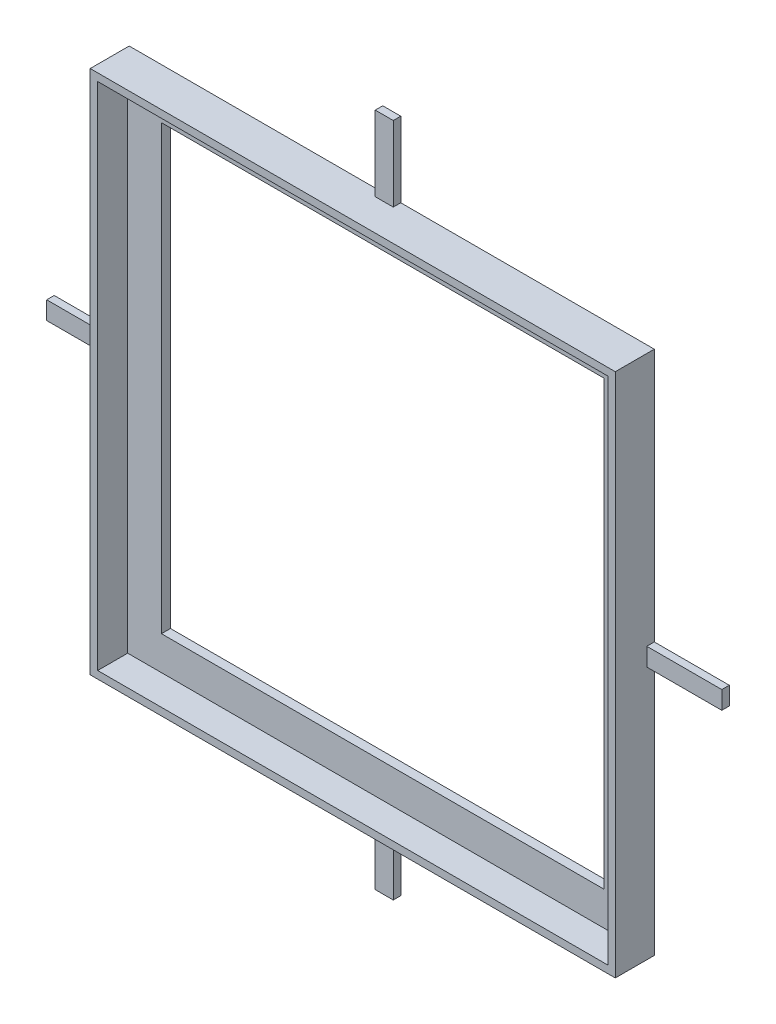
ISO-10303-21;
HEADER;
FILE_DESCRIPTION(('STEP AP214'),'2;1');
FILE_NAME('part.step','',(''),(''),'','','');
FILE_SCHEMA(('AUTOMOTIVE_DESIGN { 1 0 10303 214 1 1 1 1 }'));
ENDSEC;
DATA;
#1=APPLICATION_CONTEXT('core data for automotive mechanical design processes');
#2=APPLICATION_PROTOCOL_DEFINITION('international standard','automotive_design',2000,#1);
#3=PRODUCT_CONTEXT('',#1,'mechanical');
#4=PRODUCT('Part','Part','',(#3));
#5=PRODUCT_RELATED_PRODUCT_CATEGORY('part','',(#4));
#6=PRODUCT_DEFINITION_FORMATION('','',#4);
#7=PRODUCT_DEFINITION_CONTEXT('part definition',#1,'design');
#8=PRODUCT_DEFINITION('design','',#6,#7);
#9=PRODUCT_DEFINITION_SHAPE('','',#8);
#10=(LENGTH_UNIT() NAMED_UNIT(*) SI_UNIT(.MILLI.,.METRE.));
#11=(NAMED_UNIT(*) PLANE_ANGLE_UNIT() SI_UNIT($,.RADIAN.));
#12=(NAMED_UNIT(*) SI_UNIT($,.STERADIAN.) SOLID_ANGLE_UNIT());
#13=UNCERTAINTY_MEASURE_WITH_UNIT(LENGTH_MEASURE(1.E-05),#10,'distance_accuracy_value','');
#14=(GEOMETRIC_REPRESENTATION_CONTEXT(3) GLOBAL_UNCERTAINTY_ASSIGNED_CONTEXT((#13)) GLOBAL_UNIT_ASSIGNED_CONTEXT((#10,
#11,#12)) REPRESENTATION_CONTEXT('',''));
#15=CARTESIAN_POINT('',(0.,0.,0.));
#16=DIRECTION('',(0.,0.,1.));
#17=DIRECTION('',(1.,0.,0.));
#18=AXIS2_PLACEMENT_3D('',#15,#16,#17);
#19=CARTESIAN_POINT('',(-175.,175.,26.));
#20=DIRECTION('',(0.,-1.,0.));
#21=DIRECTION('',(0.,0.,-1.));
#22=AXIS2_PLACEMENT_3D('',#19,#20,#21);
#23=PLANE('',#22);
#24=DIRECTION('',(0.,0.,-1.));
#25=VECTOR('',#24,1.);
#26=CARTESIAN_POINT('',(6.,175.,5.));
#27=LINE('',#26,#25);
#28=CARTESIAN_POINT('',(6.,175.,5.));
#29=VERTEX_POINT('',#28);
#30=CARTESIAN_POINT('',(6.,175.,0.));
#31=VERTEX_POINT('',#30);
#32=EDGE_CURVE('E244',#29,#31,#27,.T.);
#33=ORIENTED_EDGE('',*,*,#32,.F.);
#34=DIRECTION('',(1.,0.,0.));
#35=VECTOR('',#34,1.);
#36=CARTESIAN_POINT('',(6.,175.,5.));
#37=LINE('',#36,#35);
#38=CARTESIAN_POINT('',(-6.,175.,5.));
#39=VERTEX_POINT('',#38);
#40=EDGE_CURVE('E230',#39,#29,#37,.T.);
#41=ORIENTED_EDGE('',*,*,#40,.F.);
#42=DIRECTION('',(0.,0.,-1.));
#43=VECTOR('',#42,1.);
#44=CARTESIAN_POINT('',(-6.,175.,5.));
#45=LINE('',#44,#43);
#46=CARTESIAN_POINT('',(-6.00000000000001,175.,0.));
#47=VERTEX_POINT('',#46);
#48=EDGE_CURVE('E238',#39,#47,#45,.T.);
#49=ORIENTED_EDGE('',*,*,#48,.T.);
#50=DIRECTION('',(-1.,0.,0.));
#51=VECTOR('',#50,1.);
#52=CARTESIAN_POINT('',(-175.,175.,0.));
#53=LINE('',#52,#51);
#54=CARTESIAN_POINT('',(-175.,175.,0.));
#55=VERTEX_POINT('',#54);
#56=EDGE_CURVE('E490',#47,#55,#53,.T.);
#57=ORIENTED_EDGE('',*,*,#56,.T.);
#58=DIRECTION('',(0.,0.,-1.));
#59=VECTOR('',#58,1.);
#60=CARTESIAN_POINT('',(-175.,175.,26.));
#61=LINE('',#60,#59);
#62=CARTESIAN_POINT('',(-175.,175.,26.));
#63=VERTEX_POINT('',#62);
#64=EDGE_CURVE('E48',#63,#55,#61,.T.);
#65=ORIENTED_EDGE('',*,*,#64,.F.);
#66=DIRECTION('',(-1.,0.,0.));
#67=VECTOR('',#66,1.);
#68=CARTESIAN_POINT('',(-175.,175.,26.));
#69=LINE('',#68,#67);
#70=CARTESIAN_POINT('',(175.,175.,26.));
#71=VERTEX_POINT('',#70);
#72=EDGE_CURVE('E475',#71,#63,#69,.T.);
#73=ORIENTED_EDGE('',*,*,#72,.F.);
#74=DIRECTION('',(0.,0.,-1.));
#75=VECTOR('',#74,1.);
#76=CARTESIAN_POINT('',(175.,175.,26.));
#77=LINE('',#76,#75);
#78=CARTESIAN_POINT('',(175.,175.,0.));
#79=VERTEX_POINT('',#78);
#80=EDGE_CURVE('E11',#71,#79,#77,.T.);
#81=ORIENTED_EDGE('',*,*,#80,.T.);
#82=EDGE_CURVE('E491',#79,#31,#53,.T.);
#83=ORIENTED_EDGE('',*,*,#82,.T.);
#84=EDGE_LOOP('',(#33,#41,#49,#57,#65,#73,#81,#83));
#85=FACE_BOUND('',#84,.T.);
#86=ADVANCED_FACE('F39',(#85),#23,.F.);
#87=CARTESIAN_POINT('',(175.,175.,26.));
#88=DIRECTION('',(-1.,0.,0.));
#89=DIRECTION('',(0.,-1.,0.));
#90=AXIS2_PLACEMENT_3D('',#87,#88,#89);
#91=PLANE('',#90);
#92=DIRECTION('',(0.,0.,-1.));
#93=VECTOR('',#92,1.);
#94=CARTESIAN_POINT('',(175.,-6.,5.));
#95=LINE('',#94,#93);
#96=CARTESIAN_POINT('',(175.,-6.,5.));
#97=VERTEX_POINT('',#96);
#98=CARTESIAN_POINT('',(175.,-6.,0.));
#99=VERTEX_POINT('',#98);
#100=EDGE_CURVE('E297',#97,#99,#95,.T.);
#101=ORIENTED_EDGE('',*,*,#100,.F.);
#102=DIRECTION('',(0.,-1.,0.));
#103=VECTOR('',#102,1.);
#104=CARTESIAN_POINT('',(175.,6.,5.));
#105=LINE('',#104,#103);
#106=CARTESIAN_POINT('',(175.,6.,5.));
#107=VERTEX_POINT('',#106);
#108=EDGE_CURVE('E280',#107,#97,#105,.T.);
#109=ORIENTED_EDGE('',*,*,#108,.F.);
#110=DIRECTION('',(0.,0.,-1.));
#111=VECTOR('',#110,1.);
#112=CARTESIAN_POINT('',(175.,6.,5.));
#113=LINE('',#112,#111);
#114=CARTESIAN_POINT('',(175.,6.00000000000001,0.));
#115=VERTEX_POINT('',#114);
#116=EDGE_CURVE('E300',#107,#115,#113,.T.);
#117=ORIENTED_EDGE('',*,*,#116,.T.);
#118=DIRECTION('',(0.,1.,0.));
#119=VECTOR('',#118,1.);
#120=CARTESIAN_POINT('',(175.,175.,0.));
#121=LINE('',#120,#119);
#122=EDGE_CURVE('E461',#115,#79,#121,.T.);
#123=ORIENTED_EDGE('',*,*,#122,.T.);
#124=ORIENTED_EDGE('',*,*,#80,.F.);
#125=DIRECTION('',(0.,1.,0.));
#126=VECTOR('',#125,1.);
#127=CARTESIAN_POINT('',(175.,175.,26.));
#128=LINE('',#127,#126);
#129=CARTESIAN_POINT('',(175.,-175.,26.));
#130=VERTEX_POINT('',#129);
#131=EDGE_CURVE('E471',#130,#71,#128,.T.);
#132=ORIENTED_EDGE('',*,*,#131,.F.);
#133=DIRECTION('',(0.,0.,-1.));
#134=VECTOR('',#133,1.);
#135=CARTESIAN_POINT('',(175.,-175.,26.));
#136=LINE('',#135,#134);
#137=CARTESIAN_POINT('',(175.,-175.,0.));
#138=VERTEX_POINT('',#137);
#139=EDGE_CURVE('E485',#130,#138,#136,.T.);
#140=ORIENTED_EDGE('',*,*,#139,.T.);
#141=EDGE_CURVE('E486',#138,#99,#121,.T.);
#142=ORIENTED_EDGE('',*,*,#141,.T.);
#143=EDGE_LOOP('',(#101,#109,#117,#123,#124,#132,#140,#142));
#144=FACE_BOUND('',#143,.T.);
#145=ADVANCED_FACE('F41',(#144),#91,.F.);
#146=CARTESIAN_POINT('',(-175.,-175.,26.));
#147=DIRECTION('',(0.,1.,0.));
#148=DIRECTION('',(0.,0.,1.));
#149=AXIS2_PLACEMENT_3D('',#146,#147,#148);
#150=PLANE('',#149);
#151=DIRECTION('',(0.,0.,-1.));
#152=VECTOR('',#151,1.);
#153=CARTESIAN_POINT('',(-5.99999999999999,-175.,5.));
#154=LINE('',#153,#152);
#155=CARTESIAN_POINT('',(-5.99999999999999,-175.,5.));
#156=VERTEX_POINT('',#155);
#157=CARTESIAN_POINT('',(-5.99999999999999,-175.,0.));
#158=VERTEX_POINT('',#157);
#159=EDGE_CURVE('E333',#156,#158,#154,.T.);
#160=ORIENTED_EDGE('',*,*,#159,.F.);
#161=DIRECTION('',(-1.,0.,0.));
#162=VECTOR('',#161,1.);
#163=CARTESIAN_POINT('',(6.00000000000001,-175.,5.));
#164=LINE('',#163,#162);
#165=CARTESIAN_POINT('',(6.00000000000001,-175.,5.));
#166=VERTEX_POINT('',#165);
#167=EDGE_CURVE('E315',#166,#156,#164,.T.);
#168=ORIENTED_EDGE('',*,*,#167,.F.);
#169=DIRECTION('',(0.,0.,-1.));
#170=VECTOR('',#169,1.);
#171=CARTESIAN_POINT('',(6.00000000000001,-175.,5.));
#172=LINE('',#171,#170);
#173=CARTESIAN_POINT('',(6.00000000000001,-175.,0.));
#174=VERTEX_POINT('',#173);
#175=EDGE_CURVE('E336',#166,#174,#172,.T.);
#176=ORIENTED_EDGE('',*,*,#175,.T.);
#177=DIRECTION('',(1.,0.,0.));
#178=VECTOR('',#177,1.);
#179=CARTESIAN_POINT('',(-175.,-175.,0.));
#180=LINE('',#179,#178);
#181=EDGE_CURVE('E499',#174,#138,#180,.T.);
#182=ORIENTED_EDGE('',*,*,#181,.T.);
#183=ORIENTED_EDGE('',*,*,#139,.F.);
#184=DIRECTION('',(1.,0.,0.));
#185=VECTOR('',#184,1.);
#186=CARTESIAN_POINT('',(-175.,-175.,26.));
#187=LINE('',#186,#185);
#188=CARTESIAN_POINT('',(-175.,-175.,26.));
#189=VERTEX_POINT('',#188);
#190=EDGE_CURVE('E482',#189,#130,#187,.T.);
#191=ORIENTED_EDGE('',*,*,#190,.F.);
#192=DIRECTION('',(0.,0.,-1.));
#193=VECTOR('',#192,1.);
#194=CARTESIAN_POINT('',(-175.,-175.,26.));
#195=LINE('',#194,#193);
#196=CARTESIAN_POINT('',(-175.,-175.,0.));
#197=VERTEX_POINT('',#196);
#198=EDGE_CURVE('E506',#189,#197,#195,.T.);
#199=ORIENTED_EDGE('',*,*,#198,.T.);
#200=EDGE_CURVE('E476',#197,#158,#180,.T.);
#201=ORIENTED_EDGE('',*,*,#200,.T.);
#202=EDGE_LOOP('',(#160,#168,#176,#182,#183,#191,#199,#201));
#203=FACE_BOUND('',#202,.T.);
#204=ADVANCED_FACE('F584',(#203),#150,.F.);
#205=CARTESIAN_POINT('',(-175.,175.,26.));
#206=DIRECTION('',(1.,0.,0.));
#207=DIRECTION('',(0.,1.,0.));
#208=AXIS2_PLACEMENT_3D('',#205,#206,#207);
#209=PLANE('',#208);
#210=DIRECTION('',(0.,0.,-1.));
#211=VECTOR('',#210,1.);
#212=CARTESIAN_POINT('',(-175.,6.,5.));
#213=LINE('',#212,#211);
#214=CARTESIAN_POINT('',(-175.,6.,5.));
#215=VERTEX_POINT('',#214);
#216=CARTESIAN_POINT('',(-175.,6.,0.));
#217=VERTEX_POINT('',#216);
#218=EDGE_CURVE('E371',#215,#217,#213,.T.);
#219=ORIENTED_EDGE('',*,*,#218,.F.);
#220=DIRECTION('',(0.,1.,0.));
#221=VECTOR('',#220,1.);
#222=CARTESIAN_POINT('',(-175.,6.,5.));
#223=LINE('',#222,#221);
#224=CARTESIAN_POINT('',(-175.,-6.,5.));
#225=VERTEX_POINT('',#224);
#226=EDGE_CURVE('E353',#225,#215,#223,.T.);
#227=ORIENTED_EDGE('',*,*,#226,.F.);
#228=DIRECTION('',(0.,0.,-1.));
#229=VECTOR('',#228,1.);
#230=CARTESIAN_POINT('',(-175.,-6.,5.));
#231=LINE('',#230,#229);
#232=CARTESIAN_POINT('',(-175.,-6.00000000000001,0.));
#233=VERTEX_POINT('',#232);
#234=EDGE_CURVE('E374',#225,#233,#231,.T.);
#235=ORIENTED_EDGE('',*,*,#234,.T.);
#236=DIRECTION('',(0.,-1.,0.));
#237=VECTOR('',#236,1.);
#238=CARTESIAN_POINT('',(-175.,175.,0.));
#239=LINE('',#238,#237);
#240=EDGE_CURVE('E494',#233,#197,#239,.T.);
#241=ORIENTED_EDGE('',*,*,#240,.T.);
#242=ORIENTED_EDGE('',*,*,#198,.F.);
#243=DIRECTION('',(0.,-1.,0.));
#244=VECTOR('',#243,1.);
#245=CARTESIAN_POINT('',(-175.,175.,26.));
#246=LINE('',#245,#244);
#247=EDGE_CURVE('E479',#63,#189,#246,.T.);
#248=ORIENTED_EDGE('',*,*,#247,.F.);
#249=ORIENTED_EDGE('',*,*,#64,.T.);
#250=EDGE_CURVE('E495',#55,#217,#239,.T.);
#251=ORIENTED_EDGE('',*,*,#250,.T.);
#252=EDGE_LOOP('',(#219,#227,#235,#241,#242,#248,#249,#251));
#253=FACE_BOUND('',#252,.T.);
#254=ADVANCED_FACE('F516',(#253),#209,.F.);
#255=CARTESIAN_POINT('',(0.,0.,26.));
#256=DIRECTION('',(0.,0.,1.));
#257=DIRECTION('',(1.,0.,0.));
#258=AXIS2_PLACEMENT_3D('',#255,#256,#257);
#259=PLANE('',#258);
#260=DIRECTION('',(0.,1.,0.));
#261=VECTOR('',#260,1.);
#262=CARTESIAN_POINT('',(170.,170.,26.));
#263=LINE('',#262,#261);
#264=CARTESIAN_POINT('',(170.,-170.,26.));
#265=VERTEX_POINT('',#264);
#266=CARTESIAN_POINT('',(170.,170.,26.));
#267=VERTEX_POINT('',#266);
#268=EDGE_CURVE('E426',#265,#267,#263,.T.);
#269=ORIENTED_EDGE('',*,*,#268,.F.);
#270=DIRECTION('',(1.,0.,0.));
#271=VECTOR('',#270,1.);
#272=CARTESIAN_POINT('',(-170.,-170.,26.));
#273=LINE('',#272,#271);
#274=CARTESIAN_POINT('',(-170.,-170.,26.));
#275=VERTEX_POINT('',#274);
#276=EDGE_CURVE('E432',#275,#265,#273,.T.);
#277=ORIENTED_EDGE('',*,*,#276,.F.);
#278=DIRECTION('',(0.,-1.,0.));
#279=VECTOR('',#278,1.);
#280=CARTESIAN_POINT('',(-170.,170.,26.));
#281=LINE('',#280,#279);
#282=CARTESIAN_POINT('',(-170.,170.,26.));
#283=VERTEX_POINT('',#282);
#284=EDGE_CURVE('E451',#283,#275,#281,.T.);
#285=ORIENTED_EDGE('',*,*,#284,.F.);
#286=DIRECTION('',(-1.,0.,0.));
#287=VECTOR('',#286,1.);
#288=CARTESIAN_POINT('',(-170.,170.,26.));
#289=LINE('',#288,#287);
#290=EDGE_CURVE('E447',#267,#283,#289,.T.);
#291=ORIENTED_EDGE('',*,*,#290,.F.);
#292=EDGE_LOOP('',(#269,#277,#285,#291));
#293=FACE_BOUND('',#292,.T.);
#294=ORIENTED_EDGE('',*,*,#131,.T.);
#295=ORIENTED_EDGE('',*,*,#72,.T.);
#296=ORIENTED_EDGE('',*,*,#247,.T.);
#297=ORIENTED_EDGE('',*,*,#190,.T.);
#298=EDGE_LOOP('',(#294,#295,#296,#297));
#299=FACE_BOUND('',#298,.T.);
#300=ADVANCED_FACE('F553',(#293,#299),#259,.T.);
#301=CARTESIAN_POINT('',(0.,0.,0.));
#302=DIRECTION('',(0.,0.,1.));
#303=DIRECTION('',(1.,0.,0.));
#304=AXIS2_PLACEMENT_3D('',#301,#302,#303);
#305=PLANE('',#304);
#306=DIRECTION('',(1.,0.,0.));
#307=VECTOR('',#306,1.);
#308=CARTESIAN_POINT('',(-147.5,-147.5,0.));
#309=LINE('',#308,#307);
#310=CARTESIAN_POINT('',(-147.5,-147.5,0.));
#311=VERTEX_POINT('',#310);
#312=CARTESIAN_POINT('',(147.5,-147.5,0.));
#313=VERTEX_POINT('',#312);
#314=EDGE_CURVE('E394',#311,#313,#309,.T.);
#315=ORIENTED_EDGE('',*,*,#314,.T.);
#316=DIRECTION('',(0.,1.,0.));
#317=VECTOR('',#316,1.);
#318=CARTESIAN_POINT('',(147.5,147.5,0.));
#319=LINE('',#318,#317);
#320=CARTESIAN_POINT('',(147.5,147.5,0.));
#321=VERTEX_POINT('',#320);
#322=EDGE_CURVE('E382',#313,#321,#319,.T.);
#323=ORIENTED_EDGE('',*,*,#322,.T.);
#324=DIRECTION('',(-1.,0.,0.));
#325=VECTOR('',#324,1.);
#326=CARTESIAN_POINT('',(-147.5,147.5,0.));
#327=LINE('',#326,#325);
#328=CARTESIAN_POINT('',(-147.5,147.5,0.));
#329=VERTEX_POINT('',#328);
#330=EDGE_CURVE('E386',#321,#329,#327,.T.);
#331=ORIENTED_EDGE('',*,*,#330,.T.);
#332=DIRECTION('',(0.,-1.,0.));
#333=VECTOR('',#332,1.);
#334=CARTESIAN_POINT('',(-147.5,147.5,0.));
#335=LINE('',#334,#333);
#336=EDGE_CURVE('E390',#329,#311,#335,.T.);
#337=ORIENTED_EDGE('',*,*,#336,.T.);
#338=EDGE_LOOP('',(#315,#323,#331,#337));
#339=FACE_BOUND('',#338,.T.);
#340=ORIENTED_EDGE('',*,*,#141,.F.);
#341=ORIENTED_EDGE('',*,*,#181,.F.);
#342=DIRECTION('',(0.,1.,0.));
#343=VECTOR('',#342,1.);
#344=CARTESIAN_POINT('',(6.,-225.,0.));
#345=LINE('',#344,#343);
#346=CARTESIAN_POINT('',(6.,-225.,0.));
#347=VERTEX_POINT('',#346);
#348=EDGE_CURVE('E325',#347,#174,#345,.T.);
#349=ORIENTED_EDGE('',*,*,#348,.F.);
#350=DIRECTION('',(1.,0.,0.));
#351=VECTOR('',#350,1.);
#352=CARTESIAN_POINT('',(-6.,-225.,0.));
#353=LINE('',#352,#351);
#354=CARTESIAN_POINT('',(-6.,-225.,0.));
#355=VERTEX_POINT('',#354);
#356=EDGE_CURVE('E306',#355,#347,#353,.T.);
#357=ORIENTED_EDGE('',*,*,#356,.F.);
#358=DIRECTION('',(0.,-1.,0.));
#359=VECTOR('',#358,1.);
#360=CARTESIAN_POINT('',(-6.,-225.,0.));
#361=LINE('',#360,#359);
#362=EDGE_CURVE('E312',#158,#355,#361,.T.);
#363=ORIENTED_EDGE('',*,*,#362,.F.);
#364=ORIENTED_EDGE('',*,*,#200,.F.);
#365=ORIENTED_EDGE('',*,*,#240,.F.);
#366=DIRECTION('',(1.,0.,0.));
#367=VECTOR('',#366,1.);
#368=CARTESIAN_POINT('',(-225.,-6.,0.));
#369=LINE('',#368,#367);
#370=CARTESIAN_POINT('',(-225.,-6.,0.));
#371=VERTEX_POINT('',#370);
#372=EDGE_CURVE('E363',#371,#233,#369,.T.);
#373=ORIENTED_EDGE('',*,*,#372,.F.);
#374=DIRECTION('',(0.,-1.,0.));
#375=VECTOR('',#374,1.);
#376=CARTESIAN_POINT('',(-225.,6.,0.));
#377=LINE('',#376,#375);
#378=CARTESIAN_POINT('',(-225.,6.,0.));
#379=VERTEX_POINT('',#378);
#380=EDGE_CURVE('E344',#379,#371,#377,.T.);
#381=ORIENTED_EDGE('',*,*,#380,.F.);
#382=DIRECTION('',(-1.,0.,0.));
#383=VECTOR('',#382,1.);
#384=CARTESIAN_POINT('',(-225.,6.,0.));
#385=LINE('',#384,#383);
#386=EDGE_CURVE('E350',#217,#379,#385,.T.);
#387=ORIENTED_EDGE('',*,*,#386,.F.);
#388=ORIENTED_EDGE('',*,*,#250,.F.);
#389=ORIENTED_EDGE('',*,*,#56,.F.);
#390=DIRECTION('',(0.,-1.,0.));
#391=VECTOR('',#390,1.);
#392=CARTESIAN_POINT('',(-6.,225.,0.));
#393=LINE('',#392,#391);
#394=CARTESIAN_POINT('',(-6.,225.,0.));
#395=VERTEX_POINT('',#394);
#396=EDGE_CURVE('E55',#395,#47,#393,.T.);
#397=ORIENTED_EDGE('',*,*,#396,.F.);
#398=DIRECTION('',(-1.,0.,0.));
#399=VECTOR('',#398,1.);
#400=CARTESIAN_POINT('',(-6.,225.,0.));
#401=LINE('',#400,#399);
#402=CARTESIAN_POINT('',(6.,225.,0.));
#403=VERTEX_POINT('',#402);
#404=EDGE_CURVE('E236',#403,#395,#401,.T.);
#405=ORIENTED_EDGE('',*,*,#404,.F.);
#406=DIRECTION('',(0.,1.,0.));
#407=VECTOR('',#406,1.);
#408=CARTESIAN_POINT('',(6.,225.,0.));
#409=LINE('',#408,#407);
#410=EDGE_CURVE('E259',#31,#403,#409,.T.);
#411=ORIENTED_EDGE('',*,*,#410,.F.);
#412=ORIENTED_EDGE('',*,*,#82,.F.);
#413=ORIENTED_EDGE('',*,*,#122,.F.);
#414=DIRECTION('',(-1.,0.,0.));
#415=VECTOR('',#414,1.);
#416=CARTESIAN_POINT('',(225.,6.,0.));
#417=LINE('',#416,#415);
#418=CARTESIAN_POINT('',(225.,6.,0.));
#419=VERTEX_POINT('',#418);
#420=EDGE_CURVE('E63',#419,#115,#417,.T.);
#421=ORIENTED_EDGE('',*,*,#420,.F.);
#422=DIRECTION('',(0.,1.,0.));
#423=VECTOR('',#422,1.);
#424=CARTESIAN_POINT('',(225.,6.,0.));
#425=LINE('',#424,#423);
#426=CARTESIAN_POINT('',(225.,-6.,0.));
#427=VERTEX_POINT('',#426);
#428=EDGE_CURVE('E243',#427,#419,#425,.T.);
#429=ORIENTED_EDGE('',*,*,#428,.F.);
#430=DIRECTION('',(1.,0.,0.));
#431=VECTOR('',#430,1.);
#432=CARTESIAN_POINT('',(225.,-6.,0.));
#433=LINE('',#432,#431);
#434=EDGE_CURVE('E277',#99,#427,#433,.T.);
#435=ORIENTED_EDGE('',*,*,#434,.F.);
#436=EDGE_LOOP('',(#340,#341,#349,#357,#363,#364,#365,#373,#381,#387,#388,#389,#397,#405,#411,
#412,#413,#421,#429,#435));
#437=FACE_BOUND('',#436,.T.);
#438=ADVANCED_FACE('F521',(#339,#437),#305,.F.);
#439=CARTESIAN_POINT('',(170.,170.,6.));
#440=DIRECTION('',(1.,0.,0.));
#441=DIRECTION('',(0.,1.,0.));
#442=AXIS2_PLACEMENT_3D('',#439,#440,#441);
#443=PLANE('',#442);
#444=ORIENTED_EDGE('',*,*,#268,.T.);
#445=DIRECTION('',(0.,0.,1.));
#446=VECTOR('',#445,1.);
#447=CARTESIAN_POINT('',(170.,170.,6.));
#448=LINE('',#447,#446);
#449=CARTESIAN_POINT('',(170.,170.,6.));
#450=VERTEX_POINT('',#449);
#451=EDGE_CURVE('E444',#450,#267,#448,.T.);
#452=ORIENTED_EDGE('',*,*,#451,.F.);
#453=DIRECTION('',(0.,1.,0.));
#454=VECTOR('',#453,1.);
#455=CARTESIAN_POINT('',(170.,170.,6.));
#456=LINE('',#455,#454);
#457=CARTESIAN_POINT('',(170.,-170.,6.));
#458=VERTEX_POINT('',#457);
#459=EDGE_CURVE('E427',#458,#450,#456,.T.);
#460=ORIENTED_EDGE('',*,*,#459,.F.);
#461=DIRECTION('',(0.,0.,1.));
#462=VECTOR('',#461,1.);
#463=CARTESIAN_POINT('',(170.,-170.,6.));
#464=LINE('',#463,#462);
#465=EDGE_CURVE('E458',#458,#265,#464,.T.);
#466=ORIENTED_EDGE('',*,*,#465,.T.);
#467=EDGE_LOOP('',(#444,#452,#460,#466));
#468=FACE_BOUND('',#467,.T.);
#469=ADVANCED_FACE('F592',(#468),#443,.F.);
#470=CARTESIAN_POINT('',(-170.,-170.,6.));
#471=DIRECTION('',(0.,-1.,0.));
#472=DIRECTION('',(0.,0.,-1.));
#473=AXIS2_PLACEMENT_3D('',#470,#471,#472);
#474=PLANE('',#473);
#475=ORIENTED_EDGE('',*,*,#276,.T.);
#476=ORIENTED_EDGE('',*,*,#465,.F.);
#477=DIRECTION('',(1.,0.,0.));
#478=VECTOR('',#477,1.);
#479=CARTESIAN_POINT('',(-170.,-170.,6.));
#480=LINE('',#479,#478);
#481=CARTESIAN_POINT('',(-170.,-170.,6.));
#482=VERTEX_POINT('',#481);
#483=EDGE_CURVE('E440',#482,#458,#480,.T.);
#484=ORIENTED_EDGE('',*,*,#483,.F.);
#485=DIRECTION('',(0.,0.,1.));
#486=VECTOR('',#485,1.);
#487=CARTESIAN_POINT('',(-170.,-170.,6.));
#488=LINE('',#487,#486);
#489=EDGE_CURVE('E462',#482,#275,#488,.T.);
#490=ORIENTED_EDGE('',*,*,#489,.T.);
#491=EDGE_LOOP('',(#475,#476,#484,#490));
#492=FACE_BOUND('',#491,.T.);
#493=ADVANCED_FACE('F599',(#492),#474,.F.);
#494=CARTESIAN_POINT('',(-170.,170.,6.));
#495=DIRECTION('',(-1.,0.,0.));
#496=DIRECTION('',(0.,-1.,0.));
#497=AXIS2_PLACEMENT_3D('',#494,#495,#496);
#498=PLANE('',#497);
#499=ORIENTED_EDGE('',*,*,#284,.T.);
#500=ORIENTED_EDGE('',*,*,#489,.F.);
#501=DIRECTION('',(0.,-1.,0.));
#502=VECTOR('',#501,1.);
#503=CARTESIAN_POINT('',(-170.,170.,6.));
#504=LINE('',#503,#502);
#505=CARTESIAN_POINT('',(-170.,170.,6.));
#506=VERTEX_POINT('',#505);
#507=EDGE_CURVE('E436',#506,#482,#504,.T.);
#508=ORIENTED_EDGE('',*,*,#507,.F.);
#509=DIRECTION('',(0.,0.,1.));
#510=VECTOR('',#509,1.);
#511=CARTESIAN_POINT('',(-170.,170.,6.));
#512=LINE('',#511,#510);
#513=EDGE_CURVE('E465',#506,#283,#512,.T.);
#514=ORIENTED_EDGE('',*,*,#513,.T.);
#515=EDGE_LOOP('',(#499,#500,#508,#514));
#516=FACE_BOUND('',#515,.T.);
#517=ADVANCED_FACE('F605',(#516),#498,.F.);
#518=CARTESIAN_POINT('',(-170.,170.,6.));
#519=DIRECTION('',(0.,1.,0.));
#520=DIRECTION('',(0.,0.,1.));
#521=AXIS2_PLACEMENT_3D('',#518,#519,#520);
#522=PLANE('',#521);
#523=ORIENTED_EDGE('',*,*,#290,.T.);
#524=ORIENTED_EDGE('',*,*,#513,.F.);
#525=DIRECTION('',(-1.,0.,0.));
#526=VECTOR('',#525,1.);
#527=CARTESIAN_POINT('',(-170.,170.,6.));
#528=LINE('',#527,#526);
#529=EDGE_CURVE('E431',#450,#506,#528,.T.);
#530=ORIENTED_EDGE('',*,*,#529,.F.);
#531=ORIENTED_EDGE('',*,*,#451,.T.);
#532=EDGE_LOOP('',(#523,#524,#530,#531));
#533=FACE_BOUND('',#532,.T.);
#534=ADVANCED_FACE('F601',(#533),#522,.F.);
#535=CARTESIAN_POINT('',(0.,0.,6.));
#536=DIRECTION('',(0.,0.,1.));
#537=DIRECTION('',(1.,0.,0.));
#538=AXIS2_PLACEMENT_3D('',#535,#536,#537);
#539=PLANE('',#538);
#540=DIRECTION('',(1.,0.,0.));
#541=VECTOR('',#540,1.);
#542=CARTESIAN_POINT('',(-147.5,-147.5,6.));
#543=LINE('',#542,#541);
#544=CARTESIAN_POINT('',(-147.5,-147.5,6.));
#545=VERTEX_POINT('',#544);
#546=CARTESIAN_POINT('',(147.5,-147.5,6.));
#547=VERTEX_POINT('',#546);
#548=EDGE_CURVE('E423',#545,#547,#543,.T.);
#549=ORIENTED_EDGE('',*,*,#548,.F.);
#550=DIRECTION('',(0.,-1.,0.));
#551=VECTOR('',#550,1.);
#552=CARTESIAN_POINT('',(-147.5,147.5,6.));
#553=LINE('',#552,#551);
#554=CARTESIAN_POINT('',(-147.5,147.5,6.));
#555=VERTEX_POINT('',#554);
#556=EDGE_CURVE('E420',#555,#545,#553,.T.);
#557=ORIENTED_EDGE('',*,*,#556,.F.);
#558=DIRECTION('',(-1.,0.,0.));
#559=VECTOR('',#558,1.);
#560=CARTESIAN_POINT('',(-147.5,147.5,6.));
#561=LINE('',#560,#559);
#562=CARTESIAN_POINT('',(147.5,147.5,6.));
#563=VERTEX_POINT('',#562);
#564=EDGE_CURVE('E417',#563,#555,#561,.T.);
#565=ORIENTED_EDGE('',*,*,#564,.F.);
#566=DIRECTION('',(0.,1.,0.));
#567=VECTOR('',#566,1.);
#568=CARTESIAN_POINT('',(147.5,147.5,6.));
#569=LINE('',#568,#567);
#570=EDGE_CURVE('E403',#547,#563,#569,.T.);
#571=ORIENTED_EDGE('',*,*,#570,.F.);
#572=EDGE_LOOP('',(#549,#557,#565,#571));
#573=FACE_BOUND('',#572,.T.);
#574=ORIENTED_EDGE('',*,*,#459,.T.);
#575=ORIENTED_EDGE('',*,*,#529,.T.);
#576=ORIENTED_EDGE('',*,*,#507,.T.);
#577=ORIENTED_EDGE('',*,*,#483,.T.);
#578=EDGE_LOOP('',(#574,#575,#576,#577));
#579=FACE_BOUND('',#578,.T.);
#580=ADVANCED_FACE('F604',(#573,#579),#539,.T.);
#581=CARTESIAN_POINT('',(147.5,147.5,0.));
#582=DIRECTION('',(1.,0.,0.));
#583=DIRECTION('',(0.,0.,-1.));
#584=AXIS2_PLACEMENT_3D('',#581,#582,#583);
#585=PLANE('',#584);
#586=ORIENTED_EDGE('',*,*,#570,.T.);
#587=DIRECTION('',(0.,0.,1.));
#588=VECTOR('',#587,1.);
#589=CARTESIAN_POINT('',(147.5,147.5,0.));
#590=LINE('',#589,#588);
#591=EDGE_CURVE('E398',#321,#563,#590,.T.);
#592=ORIENTED_EDGE('',*,*,#591,.F.);
#593=ORIENTED_EDGE('',*,*,#322,.F.);
#594=DIRECTION('',(0.,0.,1.));
#595=VECTOR('',#594,1.);
#596=CARTESIAN_POINT('',(147.5,-147.5,0.));
#597=LINE('',#596,#595);
#598=EDGE_CURVE('E399',#313,#547,#597,.T.);
#599=ORIENTED_EDGE('',*,*,#598,.T.);
#600=EDGE_LOOP('',(#586,#592,#593,#599));
#601=FACE_BOUND('',#600,.T.);
#602=ADVANCED_FACE('F615',(#601),#585,.F.);
#603=CARTESIAN_POINT('',(-147.5,-147.5,0.));
#604=DIRECTION('',(0.,-1.,0.));
#605=DIRECTION('',(0.,0.,-1.));
#606=AXIS2_PLACEMENT_3D('',#603,#604,#605);
#607=PLANE('',#606);
#608=ORIENTED_EDGE('',*,*,#548,.T.);
#609=ORIENTED_EDGE('',*,*,#598,.F.);
#610=ORIENTED_EDGE('',*,*,#314,.F.);
#611=DIRECTION('',(0.,0.,1.));
#612=VECTOR('',#611,1.);
#613=CARTESIAN_POINT('',(-147.5,-147.5,0.));
#614=LINE('',#613,#612);
#615=EDGE_CURVE('E404',#311,#545,#614,.T.);
#616=ORIENTED_EDGE('',*,*,#615,.T.);
#617=EDGE_LOOP('',(#608,#609,#610,#616));
#618=FACE_BOUND('',#617,.T.);
#619=ADVANCED_FACE('F619',(#618),#607,.F.);
#620=CARTESIAN_POINT('',(-147.5,147.5,0.));
#621=DIRECTION('',(-1.,0.,0.));
#622=DIRECTION('',(0.,0.,1.));
#623=AXIS2_PLACEMENT_3D('',#620,#621,#622);
#624=PLANE('',#623);
#625=ORIENTED_EDGE('',*,*,#556,.T.);
#626=ORIENTED_EDGE('',*,*,#615,.F.);
#627=ORIENTED_EDGE('',*,*,#336,.F.);
#628=DIRECTION('',(0.,0.,1.));
#629=VECTOR('',#628,1.);
#630=CARTESIAN_POINT('',(-147.5,147.5,0.));
#631=LINE('',#630,#629);
#632=EDGE_CURVE('E408',#329,#555,#631,.T.);
#633=ORIENTED_EDGE('',*,*,#632,.T.);
#634=EDGE_LOOP('',(#625,#626,#627,#633));
#635=FACE_BOUND('',#634,.T.);
#636=ADVANCED_FACE('F624',(#635),#624,.F.);
#637=CARTESIAN_POINT('',(-147.5,147.5,0.));
#638=DIRECTION('',(0.,1.,0.));
#639=DIRECTION('',(0.,0.,1.));
#640=AXIS2_PLACEMENT_3D('',#637,#638,#639);
#641=PLANE('',#640);
#642=ORIENTED_EDGE('',*,*,#564,.T.);
#643=ORIENTED_EDGE('',*,*,#632,.F.);
#644=ORIENTED_EDGE('',*,*,#330,.F.);
#645=ORIENTED_EDGE('',*,*,#591,.T.);
#646=EDGE_LOOP('',(#642,#643,#644,#645));
#647=FACE_BOUND('',#646,.T.);
#648=ADVANCED_FACE('F621',(#647),#641,.F.);
#649=CARTESIAN_POINT('',(-225.,6.,5.));
#650=DIRECTION('',(1.,0.,0.));
#651=DIRECTION('',(0.,0.,-1.));
#652=AXIS2_PLACEMENT_3D('',#649,#650,#651);
#653=PLANE('',#652);
#654=ORIENTED_EDGE('',*,*,#380,.T.);
#655=DIRECTION('',(0.,0.,-1.));
#656=VECTOR('',#655,1.);
#657=CARTESIAN_POINT('',(-225.,-6.,5.));
#658=LINE('',#657,#656);
#659=CARTESIAN_POINT('',(-225.,-6.,5.));
#660=VERTEX_POINT('',#659);
#661=EDGE_CURVE('E378',#660,#371,#658,.T.);
#662=ORIENTED_EDGE('',*,*,#661,.F.);
#663=DIRECTION('',(0.,-1.,0.));
#664=VECTOR('',#663,1.);
#665=CARTESIAN_POINT('',(-225.,6.,5.));
#666=LINE('',#665,#664);
#667=CARTESIAN_POINT('',(-225.,6.,5.));
#668=VERTEX_POINT('',#667);
#669=EDGE_CURVE('E345',#668,#660,#666,.T.);
#670=ORIENTED_EDGE('',*,*,#669,.F.);
#671=DIRECTION('',(0.,0.,-1.));
#672=VECTOR('',#671,1.);
#673=CARTESIAN_POINT('',(-225.,6.,5.));
#674=LINE('',#673,#672);
#675=EDGE_CURVE('E359',#668,#379,#674,.T.);
#676=ORIENTED_EDGE('',*,*,#675,.T.);
#677=EDGE_LOOP('',(#654,#662,#670,#676));
#678=FACE_BOUND('',#677,.T.);
#679=ADVANCED_FACE('F529',(#678),#653,.F.);
#680=CARTESIAN_POINT('',(-225.,-6.,5.));
#681=DIRECTION('',(0.,1.,0.));
#682=DIRECTION('',(0.,0.,1.));
#683=AXIS2_PLACEMENT_3D('',#680,#681,#682);
#684=PLANE('',#683);
#685=ORIENTED_EDGE('',*,*,#372,.T.);
#686=ORIENTED_EDGE('',*,*,#234,.F.);
#687=DIRECTION('',(1.,0.,0.));
#688=VECTOR('',#687,1.);
#689=CARTESIAN_POINT('',(-225.,-6.,5.));
#690=LINE('',#689,#688);
#691=EDGE_CURVE('E349',#660,#225,#690,.T.);
#692=ORIENTED_EDGE('',*,*,#691,.F.);
#693=ORIENTED_EDGE('',*,*,#661,.T.);
#694=EDGE_LOOP('',(#685,#686,#692,#693));
#695=FACE_BOUND('',#694,.T.);
#696=ADVANCED_FACE('F634',(#695),#684,.F.);
#697=CARTESIAN_POINT('',(-225.,6.,5.));
#698=DIRECTION('',(0.,-1.,0.));
#699=DIRECTION('',(0.,0.,-1.));
#700=AXIS2_PLACEMENT_3D('',#697,#698,#699);
#701=PLANE('',#700);
#702=ORIENTED_EDGE('',*,*,#386,.T.);
#703=ORIENTED_EDGE('',*,*,#675,.F.);
#704=DIRECTION('',(-1.,0.,0.));
#705=VECTOR('',#704,1.);
#706=CARTESIAN_POINT('',(-225.,6.,5.));
#707=LINE('',#706,#705);
#708=EDGE_CURVE('E356',#215,#668,#707,.T.);
#709=ORIENTED_EDGE('',*,*,#708,.F.);
#710=ORIENTED_EDGE('',*,*,#218,.T.);
#711=EDGE_LOOP('',(#702,#703,#709,#710));
#712=FACE_BOUND('',#711,.T.);
#713=ADVANCED_FACE('F525',(#712),#701,.F.);
#714=CARTESIAN_POINT('',(0.,0.,5.));
#715=DIRECTION('',(0.,0.,1.));
#716=DIRECTION('',(1.,0.,0.));
#717=AXIS2_PLACEMENT_3D('',#714,#715,#716);
#718=PLANE('',#717);
#719=ORIENTED_EDGE('',*,*,#669,.T.);
#720=ORIENTED_EDGE('',*,*,#691,.T.);
#721=ORIENTED_EDGE('',*,*,#226,.T.);
#722=ORIENTED_EDGE('',*,*,#708,.T.);
#723=EDGE_LOOP('',(#719,#720,#721,#722));
#724=FACE_BOUND('',#723,.T.);
#725=ADVANCED_FACE('F532',(#724),#718,.T.);
#726=CARTESIAN_POINT('',(-6.,-225.,5.));
#727=DIRECTION('',(0.,1.,0.));
#728=DIRECTION('',(0.,0.,1.));
#729=AXIS2_PLACEMENT_3D('',#726,#727,#728);
#730=PLANE('',#729);
#731=ORIENTED_EDGE('',*,*,#356,.T.);
#732=DIRECTION('',(0.,0.,-1.));
#733=VECTOR('',#732,1.);
#734=CARTESIAN_POINT('',(6.,-225.,5.));
#735=LINE('',#734,#733);
#736=CARTESIAN_POINT('',(6.,-225.,5.));
#737=VERTEX_POINT('',#736);
#738=EDGE_CURVE('E340',#737,#347,#735,.T.);
#739=ORIENTED_EDGE('',*,*,#738,.F.);
#740=DIRECTION('',(1.,0.,0.));
#741=VECTOR('',#740,1.);
#742=CARTESIAN_POINT('',(-6.,-225.,5.));
#743=LINE('',#742,#741);
#744=CARTESIAN_POINT('',(-6.,-225.,5.));
#745=VERTEX_POINT('',#744);
#746=EDGE_CURVE('E307',#745,#737,#743,.T.);
#747=ORIENTED_EDGE('',*,*,#746,.F.);
#748=DIRECTION('',(0.,0.,-1.));
#749=VECTOR('',#748,1.);
#750=CARTESIAN_POINT('',(-6.,-225.,5.));
#751=LINE('',#750,#749);
#752=EDGE_CURVE('E321',#745,#355,#751,.T.);
#753=ORIENTED_EDGE('',*,*,#752,.T.);
#754=EDGE_LOOP('',(#731,#739,#747,#753));
#755=FACE_BOUND('',#754,.T.);
#756=ADVANCED_FACE('F641',(#755),#730,.F.);
#757=CARTESIAN_POINT('',(6.,-225.,5.));
#758=DIRECTION('',(-1.,0.,0.));
#759=DIRECTION('',(0.,-1.,0.));
#760=AXIS2_PLACEMENT_3D('',#757,#758,#759);
#761=PLANE('',#760);
#762=ORIENTED_EDGE('',*,*,#348,.T.);
#763=ORIENTED_EDGE('',*,*,#175,.F.);
#764=DIRECTION('',(0.,1.,0.));
#765=VECTOR('',#764,1.);
#766=CARTESIAN_POINT('',(6.,-225.,5.));
#767=LINE('',#766,#765);
#768=EDGE_CURVE('E311',#737,#166,#767,.T.);
#769=ORIENTED_EDGE('',*,*,#768,.F.);
#770=ORIENTED_EDGE('',*,*,#738,.T.);
#771=EDGE_LOOP('',(#762,#763,#769,#770));
#772=FACE_BOUND('',#771,.T.);
#773=ADVANCED_FACE('F644',(#772),#761,.F.);
#774=CARTESIAN_POINT('',(-6.,-225.,5.));
#775=DIRECTION('',(1.,0.,0.));
#776=DIRECTION('',(0.,1.,0.));
#777=AXIS2_PLACEMENT_3D('',#774,#775,#776);
#778=PLANE('',#777);
#779=ORIENTED_EDGE('',*,*,#362,.T.);
#780=ORIENTED_EDGE('',*,*,#752,.F.);
#781=DIRECTION('',(0.,-1.,0.));
#782=VECTOR('',#781,1.);
#783=CARTESIAN_POINT('',(-6.,-225.,5.));
#784=LINE('',#783,#782);
#785=EDGE_CURVE('E318',#156,#745,#784,.T.);
#786=ORIENTED_EDGE('',*,*,#785,.F.);
#787=ORIENTED_EDGE('',*,*,#159,.T.);
#788=EDGE_LOOP('',(#779,#780,#786,#787));
#789=FACE_BOUND('',#788,.T.);
#790=ADVANCED_FACE('F648',(#789),#778,.F.);
#791=CARTESIAN_POINT('',(0.,0.,5.));
#792=DIRECTION('',(0.,0.,1.));
#793=DIRECTION('',(1.,0.,0.));
#794=AXIS2_PLACEMENT_3D('',#791,#792,#793);
#795=PLANE('',#794);
#796=ORIENTED_EDGE('',*,*,#746,.T.);
#797=ORIENTED_EDGE('',*,*,#768,.T.);
#798=ORIENTED_EDGE('',*,*,#167,.T.);
#799=ORIENTED_EDGE('',*,*,#785,.T.);
#800=EDGE_LOOP('',(#796,#797,#798,#799));
#801=FACE_BOUND('',#800,.T.);
#802=ADVANCED_FACE('F578',(#801),#795,.T.);
#803=CARTESIAN_POINT('',(225.,6.,5.));
#804=DIRECTION('',(-1.,0.,0.));
#805=DIRECTION('',(0.,0.,1.));
#806=AXIS2_PLACEMENT_3D('',#803,#804,#805);
#807=PLANE('',#806);
#808=ORIENTED_EDGE('',*,*,#428,.T.);
#809=DIRECTION('',(0.,0.,-1.));
#810=VECTOR('',#809,1.);
#811=CARTESIAN_POINT('',(225.,6.,5.));
#812=LINE('',#811,#810);
#813=CARTESIAN_POINT('',(225.,6.,5.));
#814=VERTEX_POINT('',#813);
#815=EDGE_CURVE('E303',#814,#419,#812,.T.);
#816=ORIENTED_EDGE('',*,*,#815,.F.);
#817=DIRECTION('',(0.,1.,0.));
#818=VECTOR('',#817,1.);
#819=CARTESIAN_POINT('',(225.,6.,5.));
#820=LINE('',#819,#818);
#821=CARTESIAN_POINT('',(225.,-6.,5.));
#822=VERTEX_POINT('',#821);
#823=EDGE_CURVE('E272',#822,#814,#820,.T.);
#824=ORIENTED_EDGE('',*,*,#823,.F.);
#825=DIRECTION('',(0.,0.,-1.));
#826=VECTOR('',#825,1.);
#827=CARTESIAN_POINT('',(225.,-6.,5.));
#828=LINE('',#827,#826);
#829=EDGE_CURVE('E286',#822,#427,#828,.T.);
#830=ORIENTED_EDGE('',*,*,#829,.T.);
#831=EDGE_LOOP('',(#808,#816,#824,#830));
#832=FACE_BOUND('',#831,.T.);
#833=ADVANCED_FACE('F566',(#832),#807,.F.);
#834=CARTESIAN_POINT('',(225.,6.,5.));
#835=DIRECTION('',(0.,-1.,0.));
#836=DIRECTION('',(0.,0.,-1.));
#837=AXIS2_PLACEMENT_3D('',#834,#835,#836);
#838=PLANE('',#837);
#839=ORIENTED_EDGE('',*,*,#420,.T.);
#840=ORIENTED_EDGE('',*,*,#116,.F.);
#841=DIRECTION('',(-1.,0.,0.));
#842=VECTOR('',#841,1.);
#843=CARTESIAN_POINT('',(225.,6.,5.));
#844=LINE('',#843,#842);
#845=EDGE_CURVE('E276',#814,#107,#844,.T.);
#846=ORIENTED_EDGE('',*,*,#845,.F.);
#847=ORIENTED_EDGE('',*,*,#815,.T.);
#848=EDGE_LOOP('',(#839,#840,#846,#847));
#849=FACE_BOUND('',#848,.T.);
#850=ADVANCED_FACE('F570',(#849),#838,.F.);
#851=CARTESIAN_POINT('',(225.,-6.,5.));
#852=DIRECTION('',(0.,1.,0.));
#853=DIRECTION('',(0.,0.,1.));
#854=AXIS2_PLACEMENT_3D('',#851,#852,#853);
#855=PLANE('',#854);
#856=ORIENTED_EDGE('',*,*,#434,.T.);
#857=ORIENTED_EDGE('',*,*,#829,.F.);
#858=DIRECTION('',(1.,0.,0.));
#859=VECTOR('',#858,1.);
#860=CARTESIAN_POINT('',(225.,-6.,5.));
#861=LINE('',#860,#859);
#862=EDGE_CURVE('E283',#97,#822,#861,.T.);
#863=ORIENTED_EDGE('',*,*,#862,.F.);
#864=ORIENTED_EDGE('',*,*,#100,.T.);
#865=EDGE_LOOP('',(#856,#857,#863,#864));
#866=FACE_BOUND('',#865,.T.);
#867=ADVANCED_FACE('F562',(#866),#855,.F.);
#868=CARTESIAN_POINT('',(0.,0.,5.));
#869=DIRECTION('',(0.,0.,-1.));
#870=DIRECTION('',(-1.,0.,0.));
#871=AXIS2_PLACEMENT_3D('',#868,#869,#870);
#872=PLANE('',#871);
#873=ORIENTED_EDGE('',*,*,#823,.T.);
#874=ORIENTED_EDGE('',*,*,#845,.T.);
#875=ORIENTED_EDGE('',*,*,#108,.T.);
#876=ORIENTED_EDGE('',*,*,#862,.T.);
#877=EDGE_LOOP('',(#873,#874,#875,#876));
#878=FACE_BOUND('',#877,.T.);
#879=ADVANCED_FACE('F569',(#878),#872,.F.);
#880=CARTESIAN_POINT('',(-6.,225.,5.));
#881=DIRECTION('',(1.,0.,0.));
#882=DIRECTION('',(0.,1.,0.));
#883=AXIS2_PLACEMENT_3D('',#880,#881,#882);
#884=PLANE('',#883);
#885=ORIENTED_EDGE('',*,*,#396,.T.);
#886=ORIENTED_EDGE('',*,*,#48,.F.);
#887=DIRECTION('',(0.,-1.,0.));
#888=VECTOR('',#887,1.);
#889=CARTESIAN_POINT('',(-6.,225.,5.));
#890=LINE('',#889,#888);
#891=CARTESIAN_POINT('',(-6.,225.,5.));
#892=VERTEX_POINT('',#891);
#893=EDGE_CURVE('E227',#892,#39,#890,.T.);
#894=ORIENTED_EDGE('',*,*,#893,.F.);
#895=DIRECTION('',(0.,0.,-1.));
#896=VECTOR('',#895,1.);
#897=CARTESIAN_POINT('',(-6.,225.,5.));
#898=LINE('',#897,#896);
#899=EDGE_CURVE('E256',#892,#395,#898,.T.);
#900=ORIENTED_EDGE('',*,*,#899,.T.);
#901=EDGE_LOOP('',(#885,#886,#894,#900));
#902=FACE_BOUND('',#901,.T.);
#903=ADVANCED_FACE('F239',(#902),#884,.F.);
#904=CARTESIAN_POINT('',(6.,225.,5.));
#905=DIRECTION('',(-1.,0.,0.));
#906=DIRECTION('',(0.,-1.,0.));
#907=AXIS2_PLACEMENT_3D('',#904,#905,#906);
#908=PLANE('',#907);
#909=ORIENTED_EDGE('',*,*,#410,.T.);
#910=DIRECTION('',(0.,0.,-1.));
#911=VECTOR('',#910,1.);
#912=CARTESIAN_POINT('',(6.,225.,5.));
#913=LINE('',#912,#911);
#914=CARTESIAN_POINT('',(6.,225.,5.));
#915=VERTEX_POINT('',#914);
#916=EDGE_CURVE('E266',#915,#403,#913,.T.);
#917=ORIENTED_EDGE('',*,*,#916,.F.);
#918=DIRECTION('',(0.,1.,0.));
#919=VECTOR('',#918,1.);
#920=CARTESIAN_POINT('',(6.,225.,5.));
#921=LINE('',#920,#919);
#922=EDGE_CURVE('E249',#29,#915,#921,.T.);
#923=ORIENTED_EDGE('',*,*,#922,.F.);
#924=ORIENTED_EDGE('',*,*,#32,.T.);
#925=EDGE_LOOP('',(#909,#917,#923,#924));
#926=FACE_BOUND('',#925,.T.);
#927=ADVANCED_FACE('F698',(#926),#908,.F.);
#928=CARTESIAN_POINT('',(-6.,225.,5.));
#929=DIRECTION('',(0.,-1.,0.));
#930=DIRECTION('',(0.,0.,-1.));
#931=AXIS2_PLACEMENT_3D('',#928,#929,#930);
#932=PLANE('',#931);
#933=ORIENTED_EDGE('',*,*,#404,.T.);
#934=ORIENTED_EDGE('',*,*,#899,.F.);
#935=DIRECTION('',(-1.,0.,0.));
#936=VECTOR('',#935,1.);
#937=CARTESIAN_POINT('',(-6.,225.,5.));
#938=LINE('',#937,#936);
#939=EDGE_CURVE('E233',#915,#892,#938,.T.);
#940=ORIENTED_EDGE('',*,*,#939,.F.);
#941=ORIENTED_EDGE('',*,*,#916,.T.);
#942=EDGE_LOOP('',(#933,#934,#940,#941));
#943=FACE_BOUND('',#942,.T.);
#944=ADVANCED_FACE('F707',(#943),#932,.F.);
#945=CARTESIAN_POINT('',(0.,0.,5.));
#946=DIRECTION('',(0.,0.,-1.));
#947=DIRECTION('',(-1.,0.,0.));
#948=AXIS2_PLACEMENT_3D('',#945,#946,#947);
#949=PLANE('',#948);
#950=ORIENTED_EDGE('',*,*,#893,.T.);
#951=ORIENTED_EDGE('',*,*,#40,.T.);
#952=ORIENTED_EDGE('',*,*,#922,.T.);
#953=ORIENTED_EDGE('',*,*,#939,.T.);
#954=EDGE_LOOP('',(#950,#951,#952,#953));
#955=FACE_BOUND('',#954,.T.);
#956=ADVANCED_FACE('F228',(#955),#949,.F.);
#957=CLOSED_SHELL('',(#86,#145,#204,#254,#300,#438,#469,#493,#517,#534,#580,#602,#619,#636,#648,
#679,#696,#713,#725,#756,#773,#790,#802,#833,#850,#867,#879,#903,#927,#944,#956));
#958=MANIFOLD_SOLID_BREP('B2',#957);
#959=ADVANCED_BREP_SHAPE_REPRESENTATION('',(#18,#958),#14);
#960=SHAPE_DEFINITION_REPRESENTATION(#9,#959);
ENDSEC;
END-ISO-10303-21;
